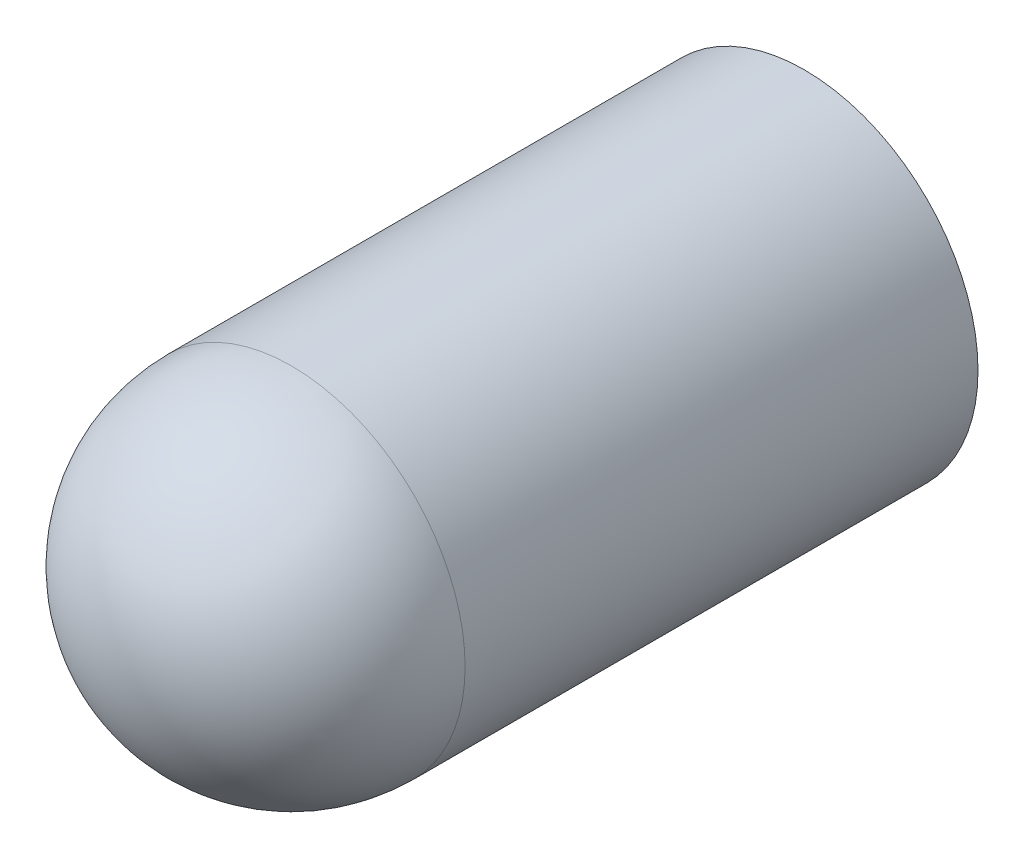
ISO-10303-21;
HEADER;
FILE_DESCRIPTION(('STEP AP214'),'2;1');
FILE_NAME('part.step','',(''),(''),'','','');
FILE_SCHEMA(('AUTOMOTIVE_DESIGN { 1 0 10303 214 1 1 1 1 }'));
ENDSEC;
DATA;
#1=APPLICATION_CONTEXT('core data for automotive mechanical design processes');
#2=APPLICATION_PROTOCOL_DEFINITION('international standard','automotive_design',2000,#1);
#3=PRODUCT_CONTEXT('',#1,'mechanical');
#4=PRODUCT('Part','Part','',(#3));
#5=PRODUCT_RELATED_PRODUCT_CATEGORY('part','',(#4));
#6=PRODUCT_DEFINITION_FORMATION('','',#4);
#7=PRODUCT_DEFINITION_CONTEXT('part definition',#1,'design');
#8=PRODUCT_DEFINITION('design','',#6,#7);
#9=PRODUCT_DEFINITION_SHAPE('','',#8);
#10=(LENGTH_UNIT() NAMED_UNIT(*) SI_UNIT(.MILLI.,.METRE.));
#11=(NAMED_UNIT(*) PLANE_ANGLE_UNIT() SI_UNIT($,.RADIAN.));
#12=(NAMED_UNIT(*) SI_UNIT($,.STERADIAN.) SOLID_ANGLE_UNIT());
#13=UNCERTAINTY_MEASURE_WITH_UNIT(LENGTH_MEASURE(1.E-05),#10,'distance_accuracy_value','');
#14=(GEOMETRIC_REPRESENTATION_CONTEXT(3) GLOBAL_UNCERTAINTY_ASSIGNED_CONTEXT((#13)) GLOBAL_UNIT_ASSIGNED_CONTEXT((#10,
#11,#12)) REPRESENTATION_CONTEXT('',''));
#15=CARTESIAN_POINT('',(0.,0.,0.));
#16=DIRECTION('',(0.,0.,1.));
#17=DIRECTION('',(1.,0.,0.));
#18=AXIS2_PLACEMENT_3D('',#15,#16,#17);
#19=CARTESIAN_POINT('',(1.27,0.,0.));
#20=DIRECTION('',(0.,0.,1.));
#21=DIRECTION('',(1.,0.,0.));
#22=AXIS2_PLACEMENT_3D('',#19,#20,#21);
#23=PLANE('',#22);
#24=CARTESIAN_POINT('',(0.,0.,0.));
#25=DIRECTION('',(0.,0.,-1.));
#26=DIRECTION('',(-1.,0.,0.));
#27=AXIS2_PLACEMENT_3D('',#24,#25,#26);
#28=CIRCLE('',#27,1.27);
#29=CARTESIAN_POINT('',(-1.27,0.,0.));
#30=VERTEX_POINT('',#29);
#31=EDGE_CURVE('E53',#30,#30,#28,.T.);
#32=ORIENTED_EDGE('',*,*,#31,.F.);
#33=EDGE_LOOP('',(#32));
#34=FACE_BOUND('',#33,.T.);
#35=CARTESIAN_POINT('',(0.,0.,0.));
#36=DIRECTION('',(0.,0.,-1.));
#37=DIRECTION('',(-1.,0.,0.));
#38=AXIS2_PLACEMENT_3D('',#35,#36,#37);
#39=CIRCLE('',#38,2.794);
#40=CARTESIAN_POINT('',(-2.794,0.,0.));
#41=VERTEX_POINT('',#40);
#42=EDGE_CURVE('E10',#41,#41,#39,.T.);
#43=ORIENTED_EDGE('',*,*,#42,.T.);
#44=EDGE_LOOP('',(#43));
#45=FACE_BOUND('',#44,.T.);
#46=ADVANCED_FACE('F39',(#34,#45),#23,.F.);
#47=CARTESIAN_POINT('',(0.,0.,0.));
#48=DIRECTION('',(0.,0.,-1.));
#49=DIRECTION('',(-1.,0.,0.));
#50=AXIS2_PLACEMENT_3D('',#47,#48,#49);
#51=CYLINDRICAL_SURFACE('',#50,2.794);
#52=ORIENTED_EDGE('',*,*,#42,.F.);
#53=EDGE_LOOP('',(#52));
#54=FACE_BOUND('',#53,.T.);
#55=CARTESIAN_POINT('',(0.,0.,8.255));
#56=DIRECTION('',(0.,0.,-1.));
#57=DIRECTION('',(-1.,0.,0.));
#58=AXIS2_PLACEMENT_3D('',#55,#56,#57);
#59=CIRCLE('',#58,2.794);
#60=CARTESIAN_POINT('',(-2.794,0.,8.255));
#61=VERTEX_POINT('',#60);
#62=EDGE_CURVE('E45',#61,#61,#59,.T.);
#63=ORIENTED_EDGE('',*,*,#62,.T.);
#64=EDGE_LOOP('',(#63));
#65=FACE_BOUND('',#64,.T.);
#66=ADVANCED_FACE('F62',(#54,#65),#51,.T.);
#67=CARTESIAN_POINT('',(0.,0.,8.255));
#68=DIRECTION('',(0.,0.,-1.));
#69=DIRECTION('',(-1.,0.,0.));
#70=AXIS2_PLACEMENT_3D('',#67,#68,#69);
#71=SPHERICAL_SURFACE('',#70,2.794);
#72=ORIENTED_EDGE('',*,*,#62,.F.);
#73=EDGE_LOOP('',(#72));
#74=FACE_BOUND('',#73,.T.);
#75=ADVANCED_FACE('F66',(#74),#71,.T.);
#76=CARTESIAN_POINT('',(0.,0.,8.255));
#77=DIRECTION('',(0.,0.,-1.));
#78=DIRECTION('',(1.,0.,0.));
#79=AXIS2_PLACEMENT_3D('',#76,#77,#78);
#80=SPHERICAL_SURFACE('',#79,1.27);
#81=CARTESIAN_POINT('',(0.,0.,8.255));
#82=DIRECTION('',(0.,0.,-1.));
#83=DIRECTION('',(-1.,0.,0.));
#84=AXIS2_PLACEMENT_3D('',#81,#82,#83);
#85=CIRCLE('',#84,1.27);
#86=CARTESIAN_POINT('',(-1.27,0.,8.255));
#87=VERTEX_POINT('',#86);
#88=EDGE_CURVE('E49',#87,#87,#85,.T.);
#89=ORIENTED_EDGE('',*,*,#88,.T.);
#90=EDGE_LOOP('',(#89));
#91=FACE_BOUND('',#90,.T.);
#92=ADVANCED_FACE('F71',(#91),#80,.F.);
#93=CARTESIAN_POINT('',(0.,0.,0.));
#94=DIRECTION('',(0.,0.,-1.));
#95=DIRECTION('',(-1.,0.,0.));
#96=AXIS2_PLACEMENT_3D('',#93,#94,#95);
#97=CYLINDRICAL_SURFACE('',#96,1.27);
#98=ORIENTED_EDGE('',*,*,#88,.F.);
#99=EDGE_LOOP('',(#98));
#100=FACE_BOUND('',#99,.T.);
#101=ORIENTED_EDGE('',*,*,#31,.T.);
#102=EDGE_LOOP('',(#101));
#103=FACE_BOUND('',#102,.T.);
#104=ADVANCED_FACE('F59',(#100,#103),#97,.F.);
#105=CLOSED_SHELL('',(#46,#66,#75,#92,#104));
#106=MANIFOLD_SOLID_BREP('B2',#105);
#107=ADVANCED_BREP_SHAPE_REPRESENTATION('',(#18,#106),#14);
#108=SHAPE_DEFINITION_REPRESENTATION(#9,#107);
ENDSEC;
END-ISO-10303-21;
